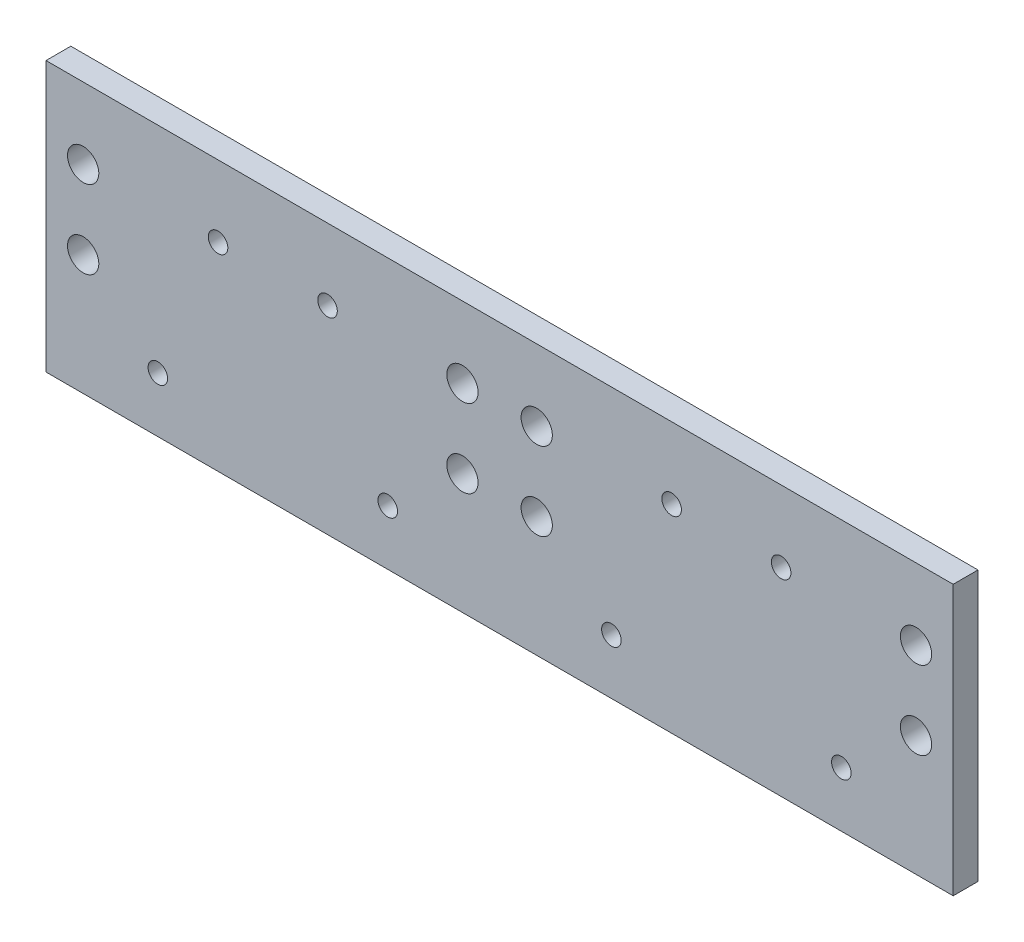
ISO-10303-21;
HEADER;
FILE_DESCRIPTION(('STEP AP214'),'2;1');
FILE_NAME('part.step','',(''),(''),'','','');
FILE_SCHEMA(('AUTOMOTIVE_DESIGN { 1 0 10303 214 1 1 1 1 }'));
ENDSEC;
DATA;
#1=APPLICATION_CONTEXT('core data for automotive mechanical design processes');
#2=APPLICATION_PROTOCOL_DEFINITION('international standard','automotive_design',2000,#1);
#3=PRODUCT_CONTEXT('',#1,'mechanical');
#4=PRODUCT('Part','Part','',(#3));
#5=PRODUCT_RELATED_PRODUCT_CATEGORY('part','',(#4));
#6=PRODUCT_DEFINITION_FORMATION('','',#4);
#7=PRODUCT_DEFINITION_CONTEXT('part definition',#1,'design');
#8=PRODUCT_DEFINITION('design','',#6,#7);
#9=PRODUCT_DEFINITION_SHAPE('','',#8);
#10=(LENGTH_UNIT() NAMED_UNIT(*) SI_UNIT(.MILLI.,.METRE.));
#11=(NAMED_UNIT(*) PLANE_ANGLE_UNIT() SI_UNIT($,.RADIAN.));
#12=(NAMED_UNIT(*) SI_UNIT($,.STERADIAN.) SOLID_ANGLE_UNIT());
#13=UNCERTAINTY_MEASURE_WITH_UNIT(LENGTH_MEASURE(1.E-05),#10,'distance_accuracy_value','');
#14=(GEOMETRIC_REPRESENTATION_CONTEXT(3) GLOBAL_UNCERTAINTY_ASSIGNED_CONTEXT((#13)) GLOBAL_UNIT_ASSIGNED_CONTEXT((#10,
#11,#12)) REPRESENTATION_CONTEXT('',''));
#15=CARTESIAN_POINT('',(0.,0.,0.));
#16=DIRECTION('',(0.,0.,1.));
#17=DIRECTION('',(1.,0.,0.));
#18=AXIS2_PLACEMENT_3D('',#15,#16,#17);
#19=CARTESIAN_POINT('',(29.0000000000001,-2.99999999999936,3.175));
#20=DIRECTION('',(-1.,0.,0.));
#21=DIRECTION('',(0.,-1.,0.));
#22=AXIS2_PLACEMENT_3D('',#19,#20,#21);
#23=PLANE('',#22);
#24=DIRECTION('',(0.,1.,0.));
#25=VECTOR('',#24,1.);
#26=CARTESIAN_POINT('',(29.0000000000001,-2.99999999999936,0.));
#27=LINE('',#26,#25);
#28=CARTESIAN_POINT('',(29.0000000000001,-37.4999999999993,0.));
#29=VERTEX_POINT('',#28);
#30=CARTESIAN_POINT('',(29.0000000000001,-2.99999999999936,0.));
#31=VERTEX_POINT('',#30);
#32=EDGE_CURVE('E95',#29,#31,#27,.T.);
#33=ORIENTED_EDGE('',*,*,#32,.T.);
#34=DIRECTION('',(0.,0.,-1.));
#35=VECTOR('',#34,1.);
#36=CARTESIAN_POINT('',(29.0000000000001,-2.99999999999936,3.175));
#37=LINE('',#36,#35);
#38=CARTESIAN_POINT('',(29.0000000000001,-2.99999999999936,3.175));
#39=VERTEX_POINT('',#38);
#40=EDGE_CURVE('E11',#39,#31,#37,.T.);
#41=ORIENTED_EDGE('',*,*,#40,.F.);
#42=DIRECTION('',(0.,1.,0.));
#43=VECTOR('',#42,1.);
#44=CARTESIAN_POINT('',(29.0000000000001,-2.99999999999936,3.175));
#45=LINE('',#44,#43);
#46=CARTESIAN_POINT('',(29.0000000000001,-37.4999999999993,3.175));
#47=VERTEX_POINT('',#46);
#48=EDGE_CURVE('E83',#47,#39,#45,.T.);
#49=ORIENTED_EDGE('',*,*,#48,.F.);
#50=DIRECTION('',(0.,0.,-1.));
#51=VECTOR('',#50,1.);
#52=CARTESIAN_POINT('',(29.0000000000001,-37.4999999999993,3.175));
#53=LINE('',#52,#51);
#54=EDGE_CURVE('E91',#47,#29,#53,.T.);
#55=ORIENTED_EDGE('',*,*,#54,.T.);
#56=EDGE_LOOP('',(#33,#41,#49,#55));
#57=FACE_BOUND('',#56,.T.);
#58=ADVANCED_FACE('F32',(#57),#23,.F.);
#59=CARTESIAN_POINT('',(-86.9999999999995,-2.99999999999936,3.175));
#60=DIRECTION('',(0.,-1.,0.));
#61=DIRECTION('',(0.,0.,-1.));
#62=AXIS2_PLACEMENT_3D('',#59,#60,#61);
#63=PLANE('',#62);
#64=DIRECTION('',(-1.,0.,0.));
#65=VECTOR('',#64,1.);
#66=CARTESIAN_POINT('',(-86.9999999999995,-2.99999999999936,0.));
#67=LINE('',#66,#65);
#68=CARTESIAN_POINT('',(-86.9999999999995,-2.99999999999936,0.));
#69=VERTEX_POINT('',#68);
#70=EDGE_CURVE('E87',#31,#69,#67,.T.);
#71=ORIENTED_EDGE('',*,*,#70,.T.);
#72=DIRECTION('',(0.,0.,-1.));
#73=VECTOR('',#72,1.);
#74=CARTESIAN_POINT('',(-86.9999999999995,-2.99999999999936,3.175));
#75=LINE('',#74,#73);
#76=CARTESIAN_POINT('',(-86.9999999999995,-2.99999999999936,3.175));
#77=VERTEX_POINT('',#76);
#78=EDGE_CURVE('E40',#77,#69,#75,.T.);
#79=ORIENTED_EDGE('',*,*,#78,.F.);
#80=DIRECTION('',(-1.,0.,0.));
#81=VECTOR('',#80,1.);
#82=CARTESIAN_POINT('',(-86.9999999999995,-2.99999999999936,3.175));
#83=LINE('',#82,#81);
#84=EDGE_CURVE('E78',#39,#77,#83,.T.);
#85=ORIENTED_EDGE('',*,*,#84,.F.);
#86=ORIENTED_EDGE('',*,*,#40,.T.);
#87=EDGE_LOOP('',(#71,#79,#85,#86));
#88=FACE_BOUND('',#87,.T.);
#89=ADVANCED_FACE('F86',(#88),#63,.F.);
#90=CARTESIAN_POINT('',(-86.9999999999995,-37.4999999999994,3.175));
#91=DIRECTION('',(1.,0.,0.));
#92=DIRECTION('',(0.,0.,-1.));
#93=AXIS2_PLACEMENT_3D('',#90,#91,#92);
#94=PLANE('',#93);
#95=DIRECTION('',(0.,-1.,0.));
#96=VECTOR('',#95,1.);
#97=CARTESIAN_POINT('',(-86.9999999999995,-37.4999999999994,0.));
#98=LINE('',#97,#96);
#99=CARTESIAN_POINT('',(-86.9999999999995,-37.4999999999994,0.));
#100=VERTEX_POINT('',#99);
#101=EDGE_CURVE('E65',#69,#100,#98,.T.);
#102=ORIENTED_EDGE('',*,*,#101,.T.);
#103=DIRECTION('',(0.,0.,-1.));
#104=VECTOR('',#103,1.);
#105=CARTESIAN_POINT('',(-86.9999999999995,-37.4999999999994,3.175));
#106=LINE('',#105,#104);
#107=CARTESIAN_POINT('',(-86.9999999999995,-37.4999999999994,3.175));
#108=VERTEX_POINT('',#107);
#109=EDGE_CURVE('E88',#108,#100,#106,.T.);
#110=ORIENTED_EDGE('',*,*,#109,.F.);
#111=DIRECTION('',(0.,-1.,0.));
#112=VECTOR('',#111,1.);
#113=CARTESIAN_POINT('',(-86.9999999999995,-37.4999999999994,3.175));
#114=LINE('',#113,#112);
#115=EDGE_CURVE('E81',#77,#108,#114,.T.);
#116=ORIENTED_EDGE('',*,*,#115,.F.);
#117=ORIENTED_EDGE('',*,*,#78,.T.);
#118=EDGE_LOOP('',(#102,#110,#116,#117));
#119=FACE_BOUND('',#118,.T.);
#120=ADVANCED_FACE('F89',(#119),#94,.F.);
#121=CARTESIAN_POINT('',(29.0000000000001,-37.4999999999993,3.175));
#122=DIRECTION('',(0.,1.,0.));
#123=DIRECTION('',(-1.,0.,0.));
#124=AXIS2_PLACEMENT_3D('',#121,#122,#123);
#125=PLANE('',#124);
#126=DIRECTION('',(1.,0.,0.));
#127=VECTOR('',#126,1.);
#128=CARTESIAN_POINT('',(29.0000000000001,-37.4999999999993,0.));
#129=LINE('',#128,#127);
#130=EDGE_CURVE('E71',#100,#29,#129,.T.);
#131=ORIENTED_EDGE('',*,*,#130,.T.);
#132=ORIENTED_EDGE('',*,*,#54,.F.);
#133=DIRECTION('',(1.,0.,0.));
#134=VECTOR('',#133,1.);
#135=CARTESIAN_POINT('',(29.0000000000001,-37.4999999999993,3.175));
#136=LINE('',#135,#134);
#137=EDGE_CURVE('E48',#108,#47,#136,.T.);
#138=ORIENTED_EDGE('',*,*,#137,.F.);
#139=ORIENTED_EDGE('',*,*,#109,.T.);
#140=EDGE_LOOP('',(#131,#132,#138,#139));
#141=FACE_BOUND('',#140,.T.);
#142=ADVANCED_FACE('F103',(#141),#125,.F.);
#143=CARTESIAN_POINT('',(0.,0.,3.175));
#144=DIRECTION('',(0.,0.,-1.));
#145=DIRECTION('',(-1.,0.,0.));
#146=AXIS2_PLACEMENT_3D('',#143,#144,#145);
#147=PLANE('',#146);
#148=CARTESIAN_POINT('',(-33.7499999999996,-22.1299999999992,3.175));
#149=DIRECTION('',(0.,0.,-1.));
#150=DIRECTION('',(-1.,0.,0.));
#151=AXIS2_PLACEMENT_3D('',#148,#149,#150);
#152=CIRCLE('',#151,2.);
#153=CARTESIAN_POINT('',(-35.7499999999996,-22.1299999999992,3.175));
#154=VERTEX_POINT('',#153);
#155=EDGE_CURVE('E131',#154,#154,#152,.T.);
#156=ORIENTED_EDGE('',*,*,#155,.T.);
#157=EDGE_LOOP('',(#156));
#158=FACE_BOUND('',#157,.T.);
#159=CARTESIAN_POINT('',(-82.2499999999996,-12.1299999999994,3.175));
#160=DIRECTION('',(0.,0.,-1.));
#161=DIRECTION('',(-1.,0.,0.));
#162=AXIS2_PLACEMENT_3D('',#159,#160,#161);
#163=CIRCLE('',#162,2.);
#164=CARTESIAN_POINT('',(-84.2499999999996,-12.1299999999994,3.175));
#165=VERTEX_POINT('',#164);
#166=EDGE_CURVE('E142',#165,#165,#163,.T.);
#167=ORIENTED_EDGE('',*,*,#166,.T.);
#168=EDGE_LOOP('',(#167));
#169=FACE_BOUND('',#168,.T.);
#170=CARTESIAN_POINT('',(-82.2499999999996,-22.1299999999994,3.175));
#171=DIRECTION('',(0.,0.,-1.));
#172=DIRECTION('',(-1.,0.,0.));
#173=AXIS2_PLACEMENT_3D('',#170,#171,#172);
#174=CIRCLE('',#173,2.);
#175=CARTESIAN_POINT('',(-84.2499999999996,-22.1299999999994,3.175));
#176=VERTEX_POINT('',#175);
#177=EDGE_CURVE('E143',#176,#176,#174,.T.);
#178=ORIENTED_EDGE('',*,*,#177,.T.);
#179=EDGE_LOOP('',(#178));
#180=FACE_BOUND('',#179,.T.);
#181=CARTESIAN_POINT('',(-72.6997474683054,-30.4497474683052,3.175));
#182=DIRECTION('',(0.,0.,-1.));
#183=DIRECTION('',(-1.,0.,0.));
#184=AXIS2_PLACEMENT_3D('',#181,#182,#183);
#185=CIRCLE('',#184,1.24999999999992);
#186=CARTESIAN_POINT('',(-73.9497474683053,-30.4497474683052,3.175));
#187=VERTEX_POINT('',#186);
#188=EDGE_CURVE('E154',#187,#187,#185,.T.);
#189=ORIENTED_EDGE('',*,*,#188,.T.);
#190=EDGE_LOOP('',(#189));
#191=FACE_BOUND('',#190,.T.);
#192=CARTESIAN_POINT('',(24.25,-12.1299999999999,3.175));
#193=DIRECTION('',(0.,0.,-1.));
#194=DIRECTION('',(-1.,0.,0.));
#195=AXIS2_PLACEMENT_3D('',#192,#193,#194);
#196=CIRCLE('',#195,2.);
#197=CARTESIAN_POINT('',(22.25,-12.1299999999999,3.175));
#198=VERTEX_POINT('',#197);
#199=EDGE_CURVE('E112',#198,#198,#196,.T.);
#200=ORIENTED_EDGE('',*,*,#199,.T.);
#201=EDGE_LOOP('',(#200));
#202=FACE_BOUND('',#201,.T.);
#203=CARTESIAN_POINT('',(-24.25,-12.1300000000001,3.175));
#204=DIRECTION('',(0.,0.,-1.));
#205=DIRECTION('',(-1.,0.,0.));
#206=AXIS2_PLACEMENT_3D('',#203,#204,#205);
#207=CIRCLE('',#206,2.);
#208=CARTESIAN_POINT('',(-26.25,-12.1300000000001,3.175));
#209=VERTEX_POINT('',#208);
#210=EDGE_CURVE('E118',#209,#209,#207,.T.);
#211=ORIENTED_EDGE('',*,*,#210,.T.);
#212=EDGE_LOOP('',(#211));
#213=FACE_BOUND('',#212,.T.);
#214=CARTESIAN_POINT('',(-24.25,-22.1300000000001,3.175));
#215=DIRECTION('',(0.,0.,-1.));
#216=DIRECTION('',(-1.,0.,0.));
#217=AXIS2_PLACEMENT_3D('',#214,#215,#216);
#218=CIRCLE('',#217,2.);
#219=CARTESIAN_POINT('',(-26.25,-22.1300000000001,3.175));
#220=VERTEX_POINT('',#219);
#221=EDGE_CURVE('E119',#220,#220,#218,.T.);
#222=ORIENTED_EDGE('',*,*,#221,.T.);
#223=EDGE_LOOP('',(#222));
#224=FACE_BOUND('',#223,.T.);
#225=CARTESIAN_POINT('',(-33.7499999999996,-12.1299999999992,3.175));
#226=DIRECTION('',(0.,0.,-1.));
#227=DIRECTION('',(-1.,0.,0.));
#228=AXIS2_PLACEMENT_3D('',#225,#226,#227);
#229=CIRCLE('',#228,2.);
#230=CARTESIAN_POINT('',(-35.7499999999996,-12.1299999999992,3.175));
#231=VERTEX_POINT('',#230);
#232=EDGE_CURVE('E130',#231,#231,#229,.T.);
#233=ORIENTED_EDGE('',*,*,#232,.T.);
#234=EDGE_LOOP('',(#233));
#235=FACE_BOUND('',#234,.T.);
#236=CARTESIAN_POINT('',(-64.9999999999995,-12.1299999999992,3.175));
#237=DIRECTION('',(0.,0.,-1.));
#238=DIRECTION('',(-1.,0.,0.));
#239=AXIS2_PLACEMENT_3D('',#236,#237,#238);
#240=CIRCLE('',#239,1.25);
#241=CARTESIAN_POINT('',(-66.2499999999995,-12.1299999999992,3.175));
#242=VERTEX_POINT('',#241);
#243=EDGE_CURVE('E155',#242,#242,#240,.T.);
#244=ORIENTED_EDGE('',*,*,#243,.T.);
#245=EDGE_LOOP('',(#244));
#246=FACE_BOUND('',#245,.T.);
#247=CARTESIAN_POINT('',(-50.9999999999996,-12.1299999999993,3.175));
#248=DIRECTION('',(0.,0.,-1.));
#249=DIRECTION('',(-1.,0.,0.));
#250=AXIS2_PLACEMENT_3D('',#247,#248,#249);
#251=CIRCLE('',#250,1.24999999999993);
#252=CARTESIAN_POINT('',(-52.2499999999995,-12.1299999999993,3.175));
#253=VERTEX_POINT('',#252);
#254=EDGE_CURVE('E196',#253,#253,#251,.T.);
#255=ORIENTED_EDGE('',*,*,#254,.T.);
#256=EDGE_LOOP('',(#255));
#257=FACE_BOUND('',#256,.T.);
#258=CARTESIAN_POINT('',(-43.3002525316937,-30.4497474683051,3.175));
#259=DIRECTION('',(0.,0.,-1.));
#260=DIRECTION('',(-1.,0.,0.));
#261=AXIS2_PLACEMENT_3D('',#258,#259,#260);
#262=CIRCLE('',#261,1.25000000000004);
#263=CARTESIAN_POINT('',(-44.5502525316937,-30.4497474683051,3.175));
#264=VERTEX_POINT('',#263);
#265=EDGE_CURVE('E190',#264,#264,#262,.T.);
#266=ORIENTED_EDGE('',*,*,#265,.T.);
#267=EDGE_LOOP('',(#266));
#268=FACE_BOUND('',#267,.T.);
#269=CARTESIAN_POINT('',(-14.6997474683058,-30.4497474683059,3.175));
#270=DIRECTION('',(0.,0.,-1.));
#271=DIRECTION('',(-1.,0.,0.));
#272=AXIS2_PLACEMENT_3D('',#269,#270,#271);
#273=CIRCLE('',#272,1.24999999999995);
#274=CARTESIAN_POINT('',(-15.9497474683058,-30.4497474683059,3.175));
#275=VERTEX_POINT('',#274);
#276=EDGE_CURVE('E184',#275,#275,#273,.T.);
#277=ORIENTED_EDGE('',*,*,#276,.T.);
#278=EDGE_LOOP('',(#277));
#279=FACE_BOUND('',#278,.T.);
#280=CARTESIAN_POINT('',(-7.00000000000002,-12.13,3.175));
#281=DIRECTION('',(0.,0.,-1.));
#282=DIRECTION('',(-1.,0.,0.));
#283=AXIS2_PLACEMENT_3D('',#280,#281,#282);
#284=CIRCLE('',#283,1.24999999999998);
#285=CARTESIAN_POINT('',(-8.25,-12.13,3.175));
#286=VERTEX_POINT('',#285);
#287=EDGE_CURVE('E178',#286,#286,#284,.T.);
#288=ORIENTED_EDGE('',*,*,#287,.T.);
#289=EDGE_LOOP('',(#288));
#290=FACE_BOUND('',#289,.T.);
#291=CARTESIAN_POINT('',(6.99999999999998,-12.13,3.175));
#292=DIRECTION('',(0.,0.,-1.));
#293=DIRECTION('',(-1.,0.,0.));
#294=AXIS2_PLACEMENT_3D('',#291,#292,#293);
#295=CIRCLE('',#294,1.24999999999997);
#296=CARTESIAN_POINT('',(5.75,-12.13,3.175));
#297=VERTEX_POINT('',#296);
#298=EDGE_CURVE('E172',#297,#297,#295,.T.);
#299=ORIENTED_EDGE('',*,*,#298,.T.);
#300=EDGE_LOOP('',(#299));
#301=FACE_BOUND('',#300,.T.);
#302=CARTESIAN_POINT('',(14.6997474683059,-30.4497474683058,3.175));
#303=DIRECTION('',(0.,0.,-1.));
#304=DIRECTION('',(-1.,0.,0.));
#305=AXIS2_PLACEMENT_3D('',#302,#303,#304);
#306=CIRCLE('',#305,1.25000000000006);
#307=CARTESIAN_POINT('',(13.4497474683059,-30.4497474683058,3.175));
#308=VERTEX_POINT('',#307);
#309=EDGE_CURVE('E166',#308,#308,#306,.T.);
#310=ORIENTED_EDGE('',*,*,#309,.T.);
#311=EDGE_LOOP('',(#310));
#312=FACE_BOUND('',#311,.T.);
#313=CARTESIAN_POINT('',(24.25,-22.1299999999999,3.175));
#314=DIRECTION('',(0.,0.,-1.));
#315=DIRECTION('',(-1.,0.,0.));
#316=AXIS2_PLACEMENT_3D('',#313,#314,#315);
#317=CIRCLE('',#316,2.);
#318=CARTESIAN_POINT('',(22.25,-22.1299999999999,3.175));
#319=VERTEX_POINT('',#318);
#320=EDGE_CURVE('E98',#319,#319,#317,.T.);
#321=ORIENTED_EDGE('',*,*,#320,.T.);
#322=EDGE_LOOP('',(#321));
#323=FACE_BOUND('',#322,.T.);
#324=ORIENTED_EDGE('',*,*,#48,.T.);
#325=ORIENTED_EDGE('',*,*,#84,.T.);
#326=ORIENTED_EDGE('',*,*,#115,.T.);
#327=ORIENTED_EDGE('',*,*,#137,.T.);
#328=EDGE_LOOP('',(#324,#325,#326,#327));
#329=FACE_BOUND('',#328,.T.);
#330=ADVANCED_FACE('F79',(#158,#169,#180,#191,#202,#213,#224,#235,#246,#257,#268,#279,#290,#301,
#312,#323,#329),#147,.F.);
#331=CARTESIAN_POINT('',(0.,0.,0.));
#332=DIRECTION('',(0.,0.,-1.));
#333=DIRECTION('',(-1.,0.,0.));
#334=AXIS2_PLACEMENT_3D('',#331,#332,#333);
#335=PLANE('',#334);
#336=CARTESIAN_POINT('',(-33.7499999999996,-22.1299999999992,0.));
#337=DIRECTION('',(0.,0.,-1.));
#338=DIRECTION('',(-1.,0.,0.));
#339=AXIS2_PLACEMENT_3D('',#336,#337,#338);
#340=CIRCLE('',#339,2.);
#341=CARTESIAN_POINT('',(-35.7499999999996,-22.1299999999992,0.));
#342=VERTEX_POINT('',#341);
#343=EDGE_CURVE('E146',#342,#342,#340,.T.);
#344=ORIENTED_EDGE('',*,*,#343,.F.);
#345=EDGE_LOOP('',(#344));
#346=FACE_BOUND('',#345,.T.);
#347=CARTESIAN_POINT('',(-82.2499999999996,-12.1299999999994,0.));
#348=DIRECTION('',(0.,0.,-1.));
#349=DIRECTION('',(-1.,0.,0.));
#350=AXIS2_PLACEMENT_3D('',#347,#348,#349);
#351=CIRCLE('',#350,2.);
#352=CARTESIAN_POINT('',(-84.2499999999996,-12.1299999999994,0.));
#353=VERTEX_POINT('',#352);
#354=EDGE_CURVE('E139',#353,#353,#351,.T.);
#355=ORIENTED_EDGE('',*,*,#354,.F.);
#356=EDGE_LOOP('',(#355));
#357=FACE_BOUND('',#356,.T.);
#358=CARTESIAN_POINT('',(-82.2499999999996,-22.1299999999994,0.));
#359=DIRECTION('',(0.,0.,-1.));
#360=DIRECTION('',(-1.,0.,0.));
#361=AXIS2_PLACEMENT_3D('',#358,#359,#360);
#362=CIRCLE('',#361,2.);
#363=CARTESIAN_POINT('',(-84.2499999999996,-22.1299999999994,0.));
#364=VERTEX_POINT('',#363);
#365=EDGE_CURVE('E158',#364,#364,#362,.T.);
#366=ORIENTED_EDGE('',*,*,#365,.F.);
#367=EDGE_LOOP('',(#366));
#368=FACE_BOUND('',#367,.T.);
#369=CARTESIAN_POINT('',(-72.6997474683054,-30.4497474683052,0.));
#370=DIRECTION('',(0.,0.,-1.));
#371=DIRECTION('',(-1.,0.,0.));
#372=AXIS2_PLACEMENT_3D('',#369,#370,#371);
#373=CIRCLE('',#372,1.24999999999992);
#374=CARTESIAN_POINT('',(-73.9497474683053,-30.4497474683052,0.));
#375=VERTEX_POINT('',#374);
#376=EDGE_CURVE('E151',#375,#375,#373,.T.);
#377=ORIENTED_EDGE('',*,*,#376,.F.);
#378=EDGE_LOOP('',(#377));
#379=FACE_BOUND('',#378,.T.);
#380=CARTESIAN_POINT('',(24.25,-12.1299999999999,0.));
#381=DIRECTION('',(0.,0.,-1.));
#382=DIRECTION('',(-1.,0.,0.));
#383=AXIS2_PLACEMENT_3D('',#380,#381,#382);
#384=CIRCLE('',#383,2.);
#385=CARTESIAN_POINT('',(22.25,-12.1299999999999,0.));
#386=VERTEX_POINT('',#385);
#387=EDGE_CURVE('E122',#386,#386,#384,.T.);
#388=ORIENTED_EDGE('',*,*,#387,.F.);
#389=EDGE_LOOP('',(#388));
#390=FACE_BOUND('',#389,.T.);
#391=CARTESIAN_POINT('',(-24.25,-12.1300000000001,0.));
#392=DIRECTION('',(0.,0.,-1.));
#393=DIRECTION('',(-1.,0.,0.));
#394=AXIS2_PLACEMENT_3D('',#391,#392,#393);
#395=CIRCLE('',#394,2.);
#396=CARTESIAN_POINT('',(-26.25,-12.1300000000001,0.));
#397=VERTEX_POINT('',#396);
#398=EDGE_CURVE('E115',#397,#397,#395,.T.);
#399=ORIENTED_EDGE('',*,*,#398,.F.);
#400=EDGE_LOOP('',(#399));
#401=FACE_BOUND('',#400,.T.);
#402=CARTESIAN_POINT('',(-24.25,-22.1300000000001,0.));
#403=DIRECTION('',(0.,0.,-1.));
#404=DIRECTION('',(-1.,0.,0.));
#405=AXIS2_PLACEMENT_3D('',#402,#403,#404);
#406=CIRCLE('',#405,2.);
#407=CARTESIAN_POINT('',(-26.25,-22.1300000000001,0.));
#408=VERTEX_POINT('',#407);
#409=EDGE_CURVE('E134',#408,#408,#406,.T.);
#410=ORIENTED_EDGE('',*,*,#409,.F.);
#411=EDGE_LOOP('',(#410));
#412=FACE_BOUND('',#411,.T.);
#413=CARTESIAN_POINT('',(-33.7499999999996,-12.1299999999992,0.));
#414=DIRECTION('',(0.,0.,-1.));
#415=DIRECTION('',(-1.,0.,0.));
#416=AXIS2_PLACEMENT_3D('',#413,#414,#415);
#417=CIRCLE('',#416,2.);
#418=CARTESIAN_POINT('',(-35.7499999999996,-12.1299999999992,0.));
#419=VERTEX_POINT('',#418);
#420=EDGE_CURVE('E127',#419,#419,#417,.T.);
#421=ORIENTED_EDGE('',*,*,#420,.F.);
#422=EDGE_LOOP('',(#421));
#423=FACE_BOUND('',#422,.T.);
#424=CARTESIAN_POINT('',(-64.9999999999995,-12.1299999999992,0.));
#425=DIRECTION('',(0.,0.,-1.));
#426=DIRECTION('',(-1.,0.,0.));
#427=AXIS2_PLACEMENT_3D('',#424,#425,#426);
#428=CIRCLE('',#427,1.25);
#429=CARTESIAN_POINT('',(-66.2499999999995,-12.1299999999992,0.));
#430=VERTEX_POINT('',#429);
#431=EDGE_CURVE('E199',#430,#430,#428,.T.);
#432=ORIENTED_EDGE('',*,*,#431,.F.);
#433=EDGE_LOOP('',(#432));
#434=FACE_BOUND('',#433,.T.);
#435=CARTESIAN_POINT('',(-50.9999999999996,-12.1299999999993,0.));
#436=DIRECTION('',(0.,0.,-1.));
#437=DIRECTION('',(-1.,0.,0.));
#438=AXIS2_PLACEMENT_3D('',#435,#436,#437);
#439=CIRCLE('',#438,1.24999999999993);
#440=CARTESIAN_POINT('',(-52.2499999999995,-12.1299999999993,0.));
#441=VERTEX_POINT('',#440);
#442=EDGE_CURVE('E193',#441,#441,#439,.T.);
#443=ORIENTED_EDGE('',*,*,#442,.F.);
#444=EDGE_LOOP('',(#443));
#445=FACE_BOUND('',#444,.T.);
#446=CARTESIAN_POINT('',(-43.3002525316937,-30.4497474683051,0.));
#447=DIRECTION('',(0.,0.,-1.));
#448=DIRECTION('',(-1.,0.,0.));
#449=AXIS2_PLACEMENT_3D('',#446,#447,#448);
#450=CIRCLE('',#449,1.25000000000004);
#451=CARTESIAN_POINT('',(-44.5502525316937,-30.4497474683051,0.));
#452=VERTEX_POINT('',#451);
#453=EDGE_CURVE('E187',#452,#452,#450,.T.);
#454=ORIENTED_EDGE('',*,*,#453,.F.);
#455=EDGE_LOOP('',(#454));
#456=FACE_BOUND('',#455,.T.);
#457=CARTESIAN_POINT('',(-14.6997474683058,-30.4497474683059,0.));
#458=DIRECTION('',(0.,0.,-1.));
#459=DIRECTION('',(-1.,0.,0.));
#460=AXIS2_PLACEMENT_3D('',#457,#458,#459);
#461=CIRCLE('',#460,1.24999999999995);
#462=CARTESIAN_POINT('',(-15.9497474683058,-30.4497474683059,0.));
#463=VERTEX_POINT('',#462);
#464=EDGE_CURVE('E181',#463,#463,#461,.T.);
#465=ORIENTED_EDGE('',*,*,#464,.F.);
#466=EDGE_LOOP('',(#465));
#467=FACE_BOUND('',#466,.T.);
#468=CARTESIAN_POINT('',(-7.00000000000002,-12.13,0.));
#469=DIRECTION('',(0.,0.,-1.));
#470=DIRECTION('',(-1.,0.,0.));
#471=AXIS2_PLACEMENT_3D('',#468,#469,#470);
#472=CIRCLE('',#471,1.24999999999998);
#473=CARTESIAN_POINT('',(-8.25,-12.13,0.));
#474=VERTEX_POINT('',#473);
#475=EDGE_CURVE('E175',#474,#474,#472,.T.);
#476=ORIENTED_EDGE('',*,*,#475,.F.);
#477=EDGE_LOOP('',(#476));
#478=FACE_BOUND('',#477,.T.);
#479=CARTESIAN_POINT('',(6.99999999999998,-12.13,0.));
#480=DIRECTION('',(0.,0.,-1.));
#481=DIRECTION('',(-1.,0.,0.));
#482=AXIS2_PLACEMENT_3D('',#479,#480,#481);
#483=CIRCLE('',#482,1.24999999999997);
#484=CARTESIAN_POINT('',(5.75,-12.13,0.));
#485=VERTEX_POINT('',#484);
#486=EDGE_CURVE('E169',#485,#485,#483,.T.);
#487=ORIENTED_EDGE('',*,*,#486,.F.);
#488=EDGE_LOOP('',(#487));
#489=FACE_BOUND('',#488,.T.);
#490=CARTESIAN_POINT('',(14.6997474683059,-30.4497474683058,0.));
#491=DIRECTION('',(0.,0.,-1.));
#492=DIRECTION('',(-1.,0.,0.));
#493=AXIS2_PLACEMENT_3D('',#490,#491,#492);
#494=CIRCLE('',#493,1.25000000000006);
#495=CARTESIAN_POINT('',(13.4497474683059,-30.4497474683058,0.));
#496=VERTEX_POINT('',#495);
#497=EDGE_CURVE('E163',#496,#496,#494,.T.);
#498=ORIENTED_EDGE('',*,*,#497,.F.);
#499=EDGE_LOOP('',(#498));
#500=FACE_BOUND('',#499,.T.);
#501=CARTESIAN_POINT('',(24.25,-22.1299999999999,0.));
#502=DIRECTION('',(0.,0.,-1.));
#503=DIRECTION('',(-1.,0.,0.));
#504=AXIS2_PLACEMENT_3D('',#501,#502,#503);
#505=CIRCLE('',#504,2.);
#506=CARTESIAN_POINT('',(22.25,-22.1299999999999,0.));
#507=VERTEX_POINT('',#506);
#508=EDGE_CURVE('E109',#507,#507,#505,.T.);
#509=ORIENTED_EDGE('',*,*,#508,.F.);
#510=EDGE_LOOP('',(#509));
#511=FACE_BOUND('',#510,.T.);
#512=ORIENTED_EDGE('',*,*,#32,.F.);
#513=ORIENTED_EDGE('',*,*,#130,.F.);
#514=ORIENTED_EDGE('',*,*,#101,.F.);
#515=ORIENTED_EDGE('',*,*,#70,.F.);
#516=EDGE_LOOP('',(#512,#513,#514,#515));
#517=FACE_BOUND('',#516,.T.);
#518=ADVANCED_FACE('F106',(#346,#357,#368,#379,#390,#401,#412,#423,#434,#445,#456,#467,#478,
#489,#500,#511,#517),#335,.T.);
#519=CARTESIAN_POINT('',(24.25,-22.1299999999999,3.175));
#520=DIRECTION('',(0.,0.,-1.));
#521=DIRECTION('',(-1.,0.,0.));
#522=AXIS2_PLACEMENT_3D('',#519,#520,#521);
#523=CYLINDRICAL_SURFACE('',#522,2.);
#524=ORIENTED_EDGE('',*,*,#320,.F.);
#525=EDGE_LOOP('',(#524));
#526=FACE_BOUND('',#525,.T.);
#527=ORIENTED_EDGE('',*,*,#508,.T.);
#528=EDGE_LOOP('',(#527));
#529=FACE_BOUND('',#528,.T.);
#530=ADVANCED_FACE('F217',(#526,#529),#523,.F.);
#531=CARTESIAN_POINT('',(14.6997474683059,-30.4497474683058,3.175));
#532=DIRECTION('',(0.,0.,-1.));
#533=DIRECTION('',(-1.,0.,0.));
#534=AXIS2_PLACEMENT_3D('',#531,#532,#533);
#535=CYLINDRICAL_SURFACE('',#534,1.25000000000006);
#536=ORIENTED_EDGE('',*,*,#309,.F.);
#537=EDGE_LOOP('',(#536));
#538=FACE_BOUND('',#537,.T.);
#539=ORIENTED_EDGE('',*,*,#497,.T.);
#540=EDGE_LOOP('',(#539));
#541=FACE_BOUND('',#540,.T.);
#542=ADVANCED_FACE('F235',(#538,#541),#535,.F.);
#543=CARTESIAN_POINT('',(6.99999999999998,-12.13,3.175));
#544=DIRECTION('',(0.,0.,-1.));
#545=DIRECTION('',(-1.,0.,0.));
#546=AXIS2_PLACEMENT_3D('',#543,#544,#545);
#547=CYLINDRICAL_SURFACE('',#546,1.24999999999997);
#548=ORIENTED_EDGE('',*,*,#298,.F.);
#549=EDGE_LOOP('',(#548));
#550=FACE_BOUND('',#549,.T.);
#551=ORIENTED_EDGE('',*,*,#486,.T.);
#552=EDGE_LOOP('',(#551));
#553=FACE_BOUND('',#552,.T.);
#554=ADVANCED_FACE('F241',(#550,#553),#547,.F.);
#555=CARTESIAN_POINT('',(-7.00000000000002,-12.13,3.175));
#556=DIRECTION('',(0.,0.,-1.));
#557=DIRECTION('',(-1.,0.,0.));
#558=AXIS2_PLACEMENT_3D('',#555,#556,#557);
#559=CYLINDRICAL_SURFACE('',#558,1.24999999999998);
#560=ORIENTED_EDGE('',*,*,#287,.F.);
#561=EDGE_LOOP('',(#560));
#562=FACE_BOUND('',#561,.T.);
#563=ORIENTED_EDGE('',*,*,#475,.T.);
#564=EDGE_LOOP('',(#563));
#565=FACE_BOUND('',#564,.T.);
#566=ADVANCED_FACE('F392',(#562,#565),#559,.F.);
#567=CARTESIAN_POINT('',(-14.6997474683058,-30.4497474683059,3.175));
#568=DIRECTION('',(0.,0.,-1.));
#569=DIRECTION('',(-1.,0.,0.));
#570=AXIS2_PLACEMENT_3D('',#567,#568,#569);
#571=CYLINDRICAL_SURFACE('',#570,1.24999999999995);
#572=ORIENTED_EDGE('',*,*,#276,.F.);
#573=EDGE_LOOP('',(#572));
#574=FACE_BOUND('',#573,.T.);
#575=ORIENTED_EDGE('',*,*,#464,.T.);
#576=EDGE_LOOP('',(#575));
#577=FACE_BOUND('',#576,.T.);
#578=ADVANCED_FACE('F383',(#574,#577),#571,.F.);
#579=CARTESIAN_POINT('',(-43.3002525316937,-30.4497474683051,3.175));
#580=DIRECTION('',(0.,0.,-1.));
#581=DIRECTION('',(-1.,0.,0.));
#582=AXIS2_PLACEMENT_3D('',#579,#580,#581);
#583=CYLINDRICAL_SURFACE('',#582,1.25000000000004);
#584=ORIENTED_EDGE('',*,*,#265,.F.);
#585=EDGE_LOOP('',(#584));
#586=FACE_BOUND('',#585,.T.);
#587=ORIENTED_EDGE('',*,*,#453,.T.);
#588=EDGE_LOOP('',(#587));
#589=FACE_BOUND('',#588,.T.);
#590=ADVANCED_FACE('F374',(#586,#589),#583,.F.);
#591=CARTESIAN_POINT('',(-50.9999999999996,-12.1299999999993,3.175));
#592=DIRECTION('',(0.,0.,-1.));
#593=DIRECTION('',(-1.,0.,0.));
#594=AXIS2_PLACEMENT_3D('',#591,#592,#593);
#595=CYLINDRICAL_SURFACE('',#594,1.24999999999993);
#596=ORIENTED_EDGE('',*,*,#254,.F.);
#597=EDGE_LOOP('',(#596));
#598=FACE_BOUND('',#597,.T.);
#599=ORIENTED_EDGE('',*,*,#442,.T.);
#600=EDGE_LOOP('',(#599));
#601=FACE_BOUND('',#600,.T.);
#602=ADVANCED_FACE('F211',(#598,#601),#595,.F.);
#603=CARTESIAN_POINT('',(-64.9999999999995,-12.1299999999992,3.175));
#604=DIRECTION('',(0.,0.,-1.));
#605=DIRECTION('',(-1.,0.,0.));
#606=AXIS2_PLACEMENT_3D('',#603,#604,#605);
#607=CYLINDRICAL_SURFACE('',#606,1.25);
#608=ORIENTED_EDGE('',*,*,#243,.F.);
#609=EDGE_LOOP('',(#608));
#610=FACE_BOUND('',#609,.T.);
#611=ORIENTED_EDGE('',*,*,#431,.T.);
#612=EDGE_LOOP('',(#611));
#613=FACE_BOUND('',#612,.T.);
#614=ADVANCED_FACE('F207',(#610,#613),#607,.F.);
#615=CARTESIAN_POINT('',(-33.7499999999996,-12.1299999999992,3.175));
#616=DIRECTION('',(0.,0.,-1.));
#617=DIRECTION('',(-1.,0.,0.));
#618=AXIS2_PLACEMENT_3D('',#615,#616,#617);
#619=CYLINDRICAL_SURFACE('',#618,2.);
#620=ORIENTED_EDGE('',*,*,#232,.F.);
#621=EDGE_LOOP('',(#620));
#622=FACE_BOUND('',#621,.T.);
#623=ORIENTED_EDGE('',*,*,#420,.T.);
#624=EDGE_LOOP('',(#623));
#625=FACE_BOUND('',#624,.T.);
#626=ADVANCED_FACE('F210',(#622,#625),#619,.F.);
#627=CARTESIAN_POINT('',(-24.25,-22.1300000000001,3.175));
#628=DIRECTION('',(0.,0.,-1.));
#629=DIRECTION('',(-1.,0.,0.));
#630=AXIS2_PLACEMENT_3D('',#627,#628,#629);
#631=CYLINDRICAL_SURFACE('',#630,2.);
#632=ORIENTED_EDGE('',*,*,#221,.F.);
#633=EDGE_LOOP('',(#632));
#634=FACE_BOUND('',#633,.T.);
#635=ORIENTED_EDGE('',*,*,#409,.T.);
#636=EDGE_LOOP('',(#635));
#637=FACE_BOUND('',#636,.T.);
#638=ADVANCED_FACE('F279',(#634,#637),#631,.F.);
#639=CARTESIAN_POINT('',(-24.25,-12.1300000000001,3.175));
#640=DIRECTION('',(0.,0.,-1.));
#641=DIRECTION('',(-1.,0.,0.));
#642=AXIS2_PLACEMENT_3D('',#639,#640,#641);
#643=CYLINDRICAL_SURFACE('',#642,2.);
#644=ORIENTED_EDGE('',*,*,#210,.F.);
#645=EDGE_LOOP('',(#644));
#646=FACE_BOUND('',#645,.T.);
#647=ORIENTED_EDGE('',*,*,#398,.T.);
#648=EDGE_LOOP('',(#647));
#649=FACE_BOUND('',#648,.T.);
#650=ADVANCED_FACE('F286',(#646,#649),#643,.F.);
#651=CARTESIAN_POINT('',(24.25,-12.1299999999999,3.175));
#652=DIRECTION('',(0.,0.,-1.));
#653=DIRECTION('',(-1.,0.,0.));
#654=AXIS2_PLACEMENT_3D('',#651,#652,#653);
#655=CYLINDRICAL_SURFACE('',#654,2.);
#656=ORIENTED_EDGE('',*,*,#199,.F.);
#657=EDGE_LOOP('',(#656));
#658=FACE_BOUND('',#657,.T.);
#659=ORIENTED_EDGE('',*,*,#387,.T.);
#660=EDGE_LOOP('',(#659));
#661=FACE_BOUND('',#660,.T.);
#662=ADVANCED_FACE('F291',(#658,#661),#655,.F.);
#663=CARTESIAN_POINT('',(-72.6997474683054,-30.4497474683052,3.175));
#664=DIRECTION('',(0.,0.,-1.));
#665=DIRECTION('',(-1.,0.,0.));
#666=AXIS2_PLACEMENT_3D('',#663,#664,#665);
#667=CYLINDRICAL_SURFACE('',#666,1.24999999999992);
#668=ORIENTED_EDGE('',*,*,#188,.F.);
#669=EDGE_LOOP('',(#668));
#670=FACE_BOUND('',#669,.T.);
#671=ORIENTED_EDGE('',*,*,#376,.T.);
#672=EDGE_LOOP('',(#671));
#673=FACE_BOUND('',#672,.T.);
#674=ADVANCED_FACE('F293',(#670,#673),#667,.F.);
#675=CARTESIAN_POINT('',(-82.2499999999996,-22.1299999999994,3.175));
#676=DIRECTION('',(0.,0.,-1.));
#677=DIRECTION('',(-1.,0.,0.));
#678=AXIS2_PLACEMENT_3D('',#675,#676,#677);
#679=CYLINDRICAL_SURFACE('',#678,2.);
#680=ORIENTED_EDGE('',*,*,#177,.F.);
#681=EDGE_LOOP('',(#680));
#682=FACE_BOUND('',#681,.T.);
#683=ORIENTED_EDGE('',*,*,#365,.T.);
#684=EDGE_LOOP('',(#683));
#685=FACE_BOUND('',#684,.T.);
#686=ADVANCED_FACE('F317',(#682,#685),#679,.F.);
#687=CARTESIAN_POINT('',(-82.2499999999996,-12.1299999999994,3.175));
#688=DIRECTION('',(0.,0.,-1.));
#689=DIRECTION('',(-1.,0.,0.));
#690=AXIS2_PLACEMENT_3D('',#687,#688,#689);
#691=CYLINDRICAL_SURFACE('',#690,2.);
#692=ORIENTED_EDGE('',*,*,#166,.F.);
#693=EDGE_LOOP('',(#692));
#694=FACE_BOUND('',#693,.T.);
#695=ORIENTED_EDGE('',*,*,#354,.T.);
#696=EDGE_LOOP('',(#695));
#697=FACE_BOUND('',#696,.T.);
#698=ADVANCED_FACE('F325',(#694,#697),#691,.F.);
#699=CARTESIAN_POINT('',(-33.7499999999996,-22.1299999999992,3.175));
#700=DIRECTION('',(0.,0.,-1.));
#701=DIRECTION('',(-1.,0.,0.));
#702=AXIS2_PLACEMENT_3D('',#699,#700,#701);
#703=CYLINDRICAL_SURFACE('',#702,2.);
#704=ORIENTED_EDGE('',*,*,#155,.F.);
#705=EDGE_LOOP('',(#704));
#706=FACE_BOUND('',#705,.T.);
#707=ORIENTED_EDGE('',*,*,#343,.T.);
#708=EDGE_LOOP('',(#707));
#709=FACE_BOUND('',#708,.T.);
#710=ADVANCED_FACE('F333',(#706,#709),#703,.F.);
#711=CLOSED_SHELL('',(#58,#89,#120,#142,#330,#518,#530,#542,#554,#566,#578,#590,#602,#614,#626,
#638,#650,#662,#674,#686,#698,#710));
#712=MANIFOLD_SOLID_BREP('B2',#711);
#713=ADVANCED_BREP_SHAPE_REPRESENTATION('',(#18,#712),#14);
#714=SHAPE_DEFINITION_REPRESENTATION(#9,#713);
ENDSEC;
END-ISO-10303-21;
